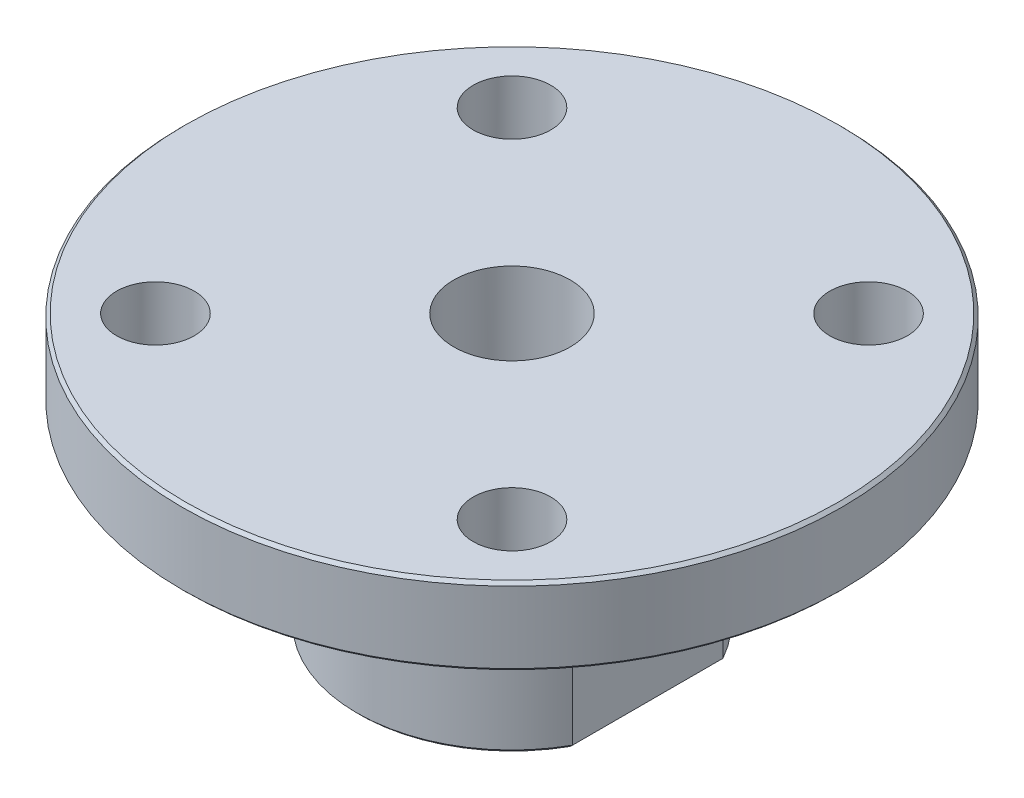
ISO-10303-21;
HEADER;
FILE_DESCRIPTION(('STEP AP214'),'2;1');
FILE_NAME('part.step','',(''),(''),'','','');
FILE_SCHEMA(('AUTOMOTIVE_DESIGN { 1 0 10303 214 1 1 1 1 }'));
ENDSEC;
DATA;
#1=APPLICATION_CONTEXT('core data for automotive mechanical design processes');
#2=APPLICATION_PROTOCOL_DEFINITION('international standard','automotive_design',2000,#1);
#3=PRODUCT_CONTEXT('',#1,'mechanical');
#4=PRODUCT('Part','Part','',(#3));
#5=PRODUCT_RELATED_PRODUCT_CATEGORY('part','',(#4));
#6=PRODUCT_DEFINITION_FORMATION('','',#4);
#7=PRODUCT_DEFINITION_CONTEXT('part definition',#1,'design');
#8=PRODUCT_DEFINITION('design','',#6,#7);
#9=PRODUCT_DEFINITION_SHAPE('','',#8);
#10=(LENGTH_UNIT() NAMED_UNIT(*) SI_UNIT(.MILLI.,.METRE.));
#11=(NAMED_UNIT(*) PLANE_ANGLE_UNIT() SI_UNIT($,.RADIAN.));
#12=(NAMED_UNIT(*) SI_UNIT($,.STERADIAN.) SOLID_ANGLE_UNIT());
#13=UNCERTAINTY_MEASURE_WITH_UNIT(LENGTH_MEASURE(1.E-05),#10,'distance_accuracy_value','');
#14=(GEOMETRIC_REPRESENTATION_CONTEXT(3) GLOBAL_UNCERTAINTY_ASSIGNED_CONTEXT((#13)) GLOBAL_UNIT_ASSIGNED_CONTEXT((#10,
#11,#12)) REPRESENTATION_CONTEXT('',''));
#15=CARTESIAN_POINT('',(0.,0.,0.));
#16=DIRECTION('',(0.,0.,1.));
#17=DIRECTION('',(1.,0.,0.));
#18=AXIS2_PLACEMENT_3D('',#15,#16,#17);
#19=CARTESIAN_POINT('',(0.00837207683599874,1.54621795524648,-2.2765147307595E-07));
#20=DIRECTION('',(0.,-1.,0.));
#21=DIRECTION('',(0.,0.,-1.));
#22=AXIS2_PLACEMENT_3D('',#19,#20,#21);
#23=CYLINDRICAL_SURFACE('',#22,5.08);
#24=DIRECTION('',(0.,-1.,0.));
#25=VECTOR('',#24,1.);
#26=CARTESIAN_POINT('',(4.453372076836,12.9762179552465,-2.45934465249318));
#27=LINE('',#26,#25);
#28=CARTESIAN_POINT('',(4.453372076836,7.89621795524648,-2.45934465249318));
#29=VERTEX_POINT('',#28);
#30=CARTESIAN_POINT('',(4.453372076836,1.64781795524648,-2.45934465249318));
#31=VERTEX_POINT('',#30);
#32=EDGE_CURVE('E101',#29,#31,#27,.T.);
#33=ORIENTED_EDGE('',*,*,#32,.T.);
#34=CARTESIAN_POINT('',(0.00837207683599874,1.64781795524647,-2.2765147307595E-07));
#35=DIRECTION('',(0.,-1.,0.));
#36=DIRECTION('',(0.,0.,-1.));
#37=AXIS2_PLACEMENT_3D('',#34,#35,#36);
#38=CIRCLE('',#37,5.08);
#39=CARTESIAN_POINT('',(-4.436627923164,1.64781795524648,-2.45934465249318));
#40=VERTEX_POINT('',#39);
#41=EDGE_CURVE('E54',#31,#40,#38,.F.);
#42=ORIENTED_EDGE('',*,*,#41,.T.);
#43=DIRECTION('',(0.,-1.,0.));
#44=VECTOR('',#43,1.);
#45=CARTESIAN_POINT('',(-4.436627923164,12.9762179552465,-2.45934465249318));
#46=LINE('',#45,#44);
#47=CARTESIAN_POINT('',(-4.436627923164,7.89621795524648,-2.45934465249318));
#48=VERTEX_POINT('',#47);
#49=EDGE_CURVE('E121',#48,#40,#46,.T.);
#50=ORIENTED_EDGE('',*,*,#49,.F.);
#51=CARTESIAN_POINT('',(0.00837207683599874,7.89621795524648,-2.2765147307595E-07));
#52=DIRECTION('',(0.,-1.,0.));
#53=DIRECTION('',(0.,0.,-1.));
#54=AXIS2_PLACEMENT_3D('',#51,#52,#53);
#55=CIRCLE('',#54,5.08);
#56=EDGE_CURVE('E118',#48,#29,#55,.T.);
#57=ORIENTED_EDGE('',*,*,#56,.T.);
#58=EDGE_LOOP('',(#33,#42,#50,#57));
#59=FACE_BOUND('',#58,.T.);
#60=ADVANCED_FACE('F32',(#59),#23,.T.);
#61=CARTESIAN_POINT('',(5.088372076836,1.54621795524648,-2.2765147307595E-07));
#62=DIRECTION('',(0.,-1.,0.));
#63=DIRECTION('',(0.,0.,-1.));
#64=AXIS2_PLACEMENT_3D('',#61,#62,#63);
#65=PLANE('',#64);
#66=CARTESIAN_POINT('',(0.00837207683599874,1.54621795524648,-2.2765147307595E-07));
#67=DIRECTION('',(0.,-1.,0.));
#68=DIRECTION('',(0.,0.,-1.));
#69=AXIS2_PLACEMENT_3D('',#66,#67,#68);
#70=CIRCLE('',#69,4.9784);
#71=CARTESIAN_POINT('',(-4.335027923164,1.54621795524648,-2.43297022335631));
#72=VERTEX_POINT('',#71);
#73=CARTESIAN_POINT('',(4.351772076836,1.54621795524648,-2.43297022335631));
#74=VERTEX_POINT('',#73);
#75=EDGE_CURVE('E152',#72,#74,#70,.T.);
#76=ORIENTED_EDGE('',*,*,#75,.T.);
#77=DIRECTION('',(0.,0.,1.));
#78=VECTOR('',#77,1.);
#79=CARTESIAN_POINT('',(4.351772076836,1.54621795524648,2.45934419719024));
#80=LINE('',#79,#78);
#81=CARTESIAN_POINT('',(4.351772076836,1.54621795524648,2.43296976805337));
#82=VERTEX_POINT('',#81);
#83=EDGE_CURVE('E158',#74,#82,#80,.T.);
#84=ORIENTED_EDGE('',*,*,#83,.T.);
#85=CARTESIAN_POINT('',(0.00837207683599874,1.54621795524648,-2.2765147307595E-07));
#86=DIRECTION('',(0.,-1.,0.));
#87=DIRECTION('',(0.,0.,-1.));
#88=AXIS2_PLACEMENT_3D('',#85,#86,#87);
#89=CIRCLE('',#88,4.9784);
#90=CARTESIAN_POINT('',(-4.335027923164,1.54621795524648,2.43296976805337));
#91=VERTEX_POINT('',#90);
#92=EDGE_CURVE('E156',#82,#91,#89,.T.);
#93=ORIENTED_EDGE('',*,*,#92,.T.);
#94=DIRECTION('',(0.,0.,-1.));
#95=VECTOR('',#94,1.);
#96=CARTESIAN_POINT('',(-4.335027923164,1.54621795524648,-2.45934465249318));
#97=LINE('',#96,#95);
#98=EDGE_CURVE('E154',#91,#72,#97,.T.);
#99=ORIENTED_EDGE('',*,*,#98,.T.);
#100=EDGE_LOOP('',(#76,#84,#93,#99));
#101=FACE_BOUND('',#100,.T.);
#102=CARTESIAN_POINT('',(0.00837207683599874,1.54621795524648,-2.2765147307595E-07));
#103=DIRECTION('',(0.,-1.,0.));
#104=DIRECTION('',(0.,0.,-1.));
#105=AXIS2_PLACEMENT_3D('',#102,#103,#104);
#106=CIRCLE('',#105,1.905);
#107=CARTESIAN_POINT('',(0.00837207683599874,1.54621795524648,-1.90500022765147));
#108=VERTEX_POINT('',#107);
#109=EDGE_CURVE('E128',#108,#108,#106,.T.);
#110=ORIENTED_EDGE('',*,*,#109,.F.);
#111=EDGE_LOOP('',(#110));
#112=FACE_BOUND('',#111,.T.);
#113=ADVANCED_FACE('F219',(#101,#112),#65,.T.);
#114=CARTESIAN_POINT('',(0.00837207683599874,1.54621795524648,-2.2765147307595E-07));
#115=DIRECTION('',(0.,-1.,0.));
#116=DIRECTION('',(0.,0.,-1.));
#117=AXIS2_PLACEMENT_3D('',#114,#115,#116);
#118=CYLINDRICAL_SURFACE('',#117,1.905);
#119=CARTESIAN_POINT('',(-1.41153108887637,5.35621795524648,-1.27000022765147));
#120=CARTESIAN_POINT('',(-1.41153715765289,5.41821193264805,-1.26999676053707));
#121=CARTESIAN_POINT('',(-1.41566667431526,5.48022758385157,-1.26542183004974));
#122=CARTESIAN_POINT('',(-1.43137594854927,5.60203909914475,-1.24751023146906));
#123=CARTESIAN_POINT('',(-1.44296906932471,5.66183077780775,-1.2341578468844));
#124=CARTESIAN_POINT('',(-1.47153724315637,5.77705496083881,-1.19974294929809));
#125=CARTESIAN_POINT('',(-1.48845984055972,5.83252364267489,-1.17875528704173));
#126=CARTESIAN_POINT('',(-1.52568692439359,5.93906275878661,-1.12988118095044));
#127=CARTESIAN_POINT('',(-1.54599211287258,5.99013227668154,-1.10199330440871));
#128=CARTESIAN_POINT('',(-1.59148548628237,6.09513372888321,-1.03506553120046));
#129=CARTESIAN_POINT('',(-1.61694176733781,6.1482738499969,-0.994965442769973));
#130=CARTESIAN_POINT('',(-1.66767757657033,6.24775967538165,-0.906902273004791));
#131=CARTESIAN_POINT('',(-1.6929569074562,6.29409868149964,-0.858931537325932));
#132=CARTESIAN_POINT('',(-1.7447919207898,6.38532667857284,-0.74812986229025));
#133=CARTESIAN_POINT('',(-1.77100451329196,6.42903935022403,-0.684153316834424));
#134=CARTESIAN_POINT('',(-1.81762429962955,6.50470568588267,-0.547669289926241));
#135=CARTESIAN_POINT('',(-1.83803797323108,6.53667248665628,-0.475171459375756));
#136=CARTESIAN_POINT('',(-1.86868733556501,6.58402626989256,-0.332263389311276));
#137=CARTESIAN_POINT('',(-1.87980788832476,6.60087087900116,-0.262531278141673));
#138=CARTESIAN_POINT('',(-1.8941498068472,6.62252510594159,-0.120456837594936));
#139=CARTESIAN_POINT('',(-1.89738112055498,6.62734988035464,-0.048117912267972));
#140=CARTESIAN_POINT('',(-1.89570947010475,6.62483844952883,0.0851831492460559));
#141=CARTESIAN_POINT('',(-1.89196870534331,6.61923990766015,0.146202577484084));
#142=CARTESIAN_POINT('',(-1.87889988388063,6.59949013763357,0.266216304475621));
#143=CARTESIAN_POINT('',(-1.8695714197022,6.58533828573373,0.325210455206101));
#144=CARTESIAN_POINT('',(-1.84615870548273,6.54925869540192,0.439469262769719));
#145=CARTESIAN_POINT('',(-1.83209336835401,6.5273618631454,0.494747718490712));
#146=CARTESIAN_POINT('',(-1.80024193658843,6.47664139197144,0.600842583013535));
#147=CARTESIAN_POINT('',(-1.78245516284578,6.44781648864302,0.651658175004097));
#148=CARTESIAN_POINT('',(-1.74180259432596,6.37985145695945,0.754560297745311));
#149=CARTESIAN_POINT('',(-1.71857651899336,6.33985357791746,0.805936362781671));
#150=CARTESIAN_POINT('',(-1.67057174476544,6.25290229377647,0.901692199962761));
#151=CARTESIAN_POINT('',(-1.64579068554072,6.20593815957851,0.946060958197078));
#152=CARTESIAN_POINT('',(-1.59278070855937,6.09792131676104,1.03360346666968));
#153=CARTESIAN_POINT('',(-1.56461385522074,6.03581331962779,1.07552208870088));
#154=CARTESIAN_POINT('',(-1.51229805194143,5.90389920734132,1.14830122825233));
#155=CARTESIAN_POINT('',(-1.48814240241046,5.83410625879363,1.1791802858071));
#156=CARTESIAN_POINT('',(-1.45379714961281,5.70882135083008,1.22131257335392));
#157=CARTESIAN_POINT('',(-1.44158923823239,5.65492616526042,1.23565129994541));
#158=CARTESIAN_POINT('',(-1.42297532582784,5.54478787921274,1.25716995028156));
#159=CARTESIAN_POINT('',(-1.41655926673121,5.48854902715167,1.26436228657225));
#160=CARTESIAN_POINT('',(-1.41051991003456,5.37498665885633,1.27113896329409));
#161=CARTESIAN_POINT('',(-1.41092616321887,5.31765949888694,1.27069020628141));
#162=CARTESIAN_POINT('',(-1.41853566350407,5.20401872068429,1.26213612104673));
#163=CARTESIAN_POINT('',(-1.4257444202238,5.14770596173554,1.25402458642978));
#164=CARTESIAN_POINT('',(-1.44532058030363,5.04037567510495,1.2312635733888));
#165=CARTESIAN_POINT('',(-1.45741866109298,4.98923386003938,1.2169529806231));
#166=CARTESIAN_POINT('',(-1.48533815981659,4.890047795345,1.18251608668034));
#167=CARTESIAN_POINT('',(-1.50116082785043,4.84200459262942,1.16238783237804));
#168=CARTESIAN_POINT('',(-1.53856084416034,4.74013968284825,1.11228702329823));
#169=CARTESIAN_POINT('',(-1.56065629092804,4.68708238009517,1.08115095551559));
#170=CARTESIAN_POINT('',(-1.60619489286125,4.58633328576696,1.01188961755843));
#171=CARTESIAN_POINT('',(-1.62963966477824,4.53864814216811,0.973755837861939));
#172=CARTESIAN_POINT('',(-1.6812084802623,4.43930186453922,0.88186654875959));
#173=CARTESIAN_POINT('',(-1.70923594418009,4.38904764659141,0.826518226697012));
#174=CARTESIAN_POINT('',(-1.7618528679222,4.29842436159676,0.706817947665731));
#175=CARTESIAN_POINT('',(-1.78644535709245,4.25804656050265,0.642474025537757));
#176=CARTESIAN_POINT('',(-1.82544963803967,4.19550670103042,0.519104318857109));
#177=CARTESIAN_POINT('',(-1.84090958216557,4.17133557492594,0.461430374050467));
#178=CARTESIAN_POINT('',(-1.86664771812304,4.13155238685391,0.342110517527426));
#179=CARTESIAN_POINT('',(-1.87693028585205,4.11593309593077,0.280468009899079));
#180=CARTESIAN_POINT('',(-1.89141053473294,4.09403038320863,0.154539336460978));
#181=CARTESIAN_POINT('',(-1.89558113110274,4.08778851375967,0.0902426937954062));
#182=CARTESIAN_POINT('',(-1.89732528669874,4.08517156959668,-0.0386434997301749));
#183=CARTESIAN_POINT('',(-1.89489945912609,4.08879557775432,-0.103233022806896));
#184=CARTESIAN_POINT('',(-1.88411560361995,4.10505173076445,-0.225906260806836));
#185=CARTESIAN_POINT('',(-1.87620173344657,4.11700973063372,-0.284121543501264));
#186=CARTESIAN_POINT('',(-1.85558219757804,4.1485990912351,-0.397521926254604));
#187=CARTESIAN_POINT('',(-1.84287578750811,4.16823164399199,-0.452706554067647));
#188=CARTESIAN_POINT('',(-1.81275563400133,4.21571903284784,-0.562068760997777));
#189=CARTESIAN_POINT('',(-1.79511205397325,4.24398390050586,-0.616003306793642));
#190=CARTESIAN_POINT('',(-1.75677176545925,4.30729361458398,-0.718536168455294));
#191=CARTESIAN_POINT('',(-1.73607323186142,4.342342517896,-0.767131263903235));
#192=CARTESIAN_POINT('',(-1.6895730380137,4.42443730823004,-0.865692058630375));
#193=CARTESIAN_POINT('',(-1.6634807762853,4.47250307527949,-0.914671242642152));
#194=CARTESIAN_POINT('',(-1.61121674423824,4.57587505412809,-1.00431636913961));
#195=CARTESIAN_POINT('',(-1.58504492917448,4.63118663215613,-1.04497609250838));
#196=CARTESIAN_POINT('',(-1.53711767946239,4.74399387537609,-1.11450938749338));
#197=CARTESIAN_POINT('',(-1.51517762397509,4.80100050456495,-1.14404573544876));
#198=CARTESIAN_POINT('',(-1.47592455826699,4.92015358035714,-1.1945355725122));
#199=CARTESIAN_POINT('',(-1.45860258188919,4.98228975584895,-1.21550573593794));
#200=CARTESIAN_POINT('',(-1.43429110291658,5.09635783769607,-1.24419549434174));
#201=CARTESIAN_POINT('',(-1.42586238901846,5.14749868560832,-1.2538218778216));
#202=CARTESIAN_POINT('',(-1.41448207018566,5.25116126956686,-1.26672309310165));
#203=CARTESIAN_POINT('',(-1.41152594595737,5.30368182985195,-1.27000316582007));
#204=CARTESIAN_POINT('',(-1.41153108887637,5.35621795524648,-1.27000022765147));
#205=B_SPLINE_CURVE_WITH_KNOTS('',3,(#119,#120,#121,#122,#123,#124,#125,#126,#127,#128,#129,
#130,#131,#132,#133,#134,#135,#136,#137,#138,#139,#140,#141,#142,#143,#144,#145,#146,#147,#148,
#149,#150,#151,#152,#153,#154,#155,#156,#157,#158,#159,#160,#161,#162,#163,#164,#165,#166,#167,
#168,#169,#170,#171,#172,#173,#174,#175,#176,#177,#178,#179,#180,#181,#182,#183,#184,#185,#186,
#187,#188,#189,#190,#191,#192,#193,#194,#195,#196,#197,#198,#199,#200,#201,#202,#203,#204),
.UNSPECIFIED.,.T.,.F.,(4,2,2,2,2,2,2,2,2,2,2,2,2,2,2,2,2,2,2,2,2,2,2,2,2,2,2,2,2,2,2,2,2,2,2,2,
2,2,2,2,2,2,4),(0.,0.185741901008567,0.371817291834648,0.556115633522332,0.740452273642586,
0.953482199385849,1.16672054207035,1.41076064688994,1.65452697661748,1.87094801110373,
2.08709600797069,2.27037604696896,2.45366945310179,2.63623953302976,2.81884295833405,
3.02544178976113,3.23236218395865,3.47140976725639,3.71005398287407,3.88065067404841,
4.05095053559534,4.22198823900153,4.39316459167329,4.55597546833904,4.71884106804548,
4.91426011082439,5.10991838567911,5.34831724669764,5.58650451512541,5.77894818687381,
5.97122893183132,6.16435920582967,6.35747152712255,6.5365425672753,6.71564143210904,
6.90510342994999,7.09467907915193,7.3140710098962,7.53362635014766,7.7364216987987,
7.93882039771211,8.09635551352155,8.25376047786503),.UNSPECIFIED.);
#206=CARTESIAN_POINT('',(-1.41153108887637,5.35621795524648,-1.27000022765147));
#207=VERTEX_POINT('',#206);
#208=EDGE_CURVE('E113',#207,#207,#205,.T.);
#209=ORIENTED_EDGE('',*,*,#208,.F.);
#210=EDGE_LOOP('',(#209));
#211=FACE_BOUND('',#210,.T.);
#212=ORIENTED_EDGE('',*,*,#109,.T.);
#213=EDGE_LOOP('',(#212));
#214=FACE_BOUND('',#213,.T.);
#215=CARTESIAN_POINT('',(0.00837207683599874,10.4362179552465,-2.2765147307595E-07));
#216=DIRECTION('',(0.,-1.,0.));
#217=DIRECTION('',(0.,0.,-1.));
#218=AXIS2_PLACEMENT_3D('',#215,#216,#217);
#219=CIRCLE('',#218,1.905);
#220=CARTESIAN_POINT('',(0.00837207683599874,10.4362179552465,-1.90500022765147));
#221=VERTEX_POINT('',#220);
#222=EDGE_CURVE('E120',#221,#221,#219,.T.);
#223=ORIENTED_EDGE('',*,*,#222,.F.);
#224=EDGE_LOOP('',(#223));
#225=FACE_BOUND('',#224,.T.);
#226=ADVANCED_FACE('F238',(#211,#214,#225),#118,.F.);
#227=CARTESIAN_POINT('',(10.803372076836,10.4362179552465,-2.2765147307595E-07));
#228=DIRECTION('',(0.,1.,0.));
#229=DIRECTION('',(0.,0.,1.));
#230=AXIS2_PLACEMENT_3D('',#227,#228,#229);
#231=PLANE('',#230);
#232=CARTESIAN_POINT('',(0.00837207683599874,10.4362179552465,-2.2765147307595E-07));
#233=DIRECTION('',(0.,1.,0.));
#234=DIRECTION('',(0.,0.,1.));
#235=AXIS2_PLACEMENT_3D('',#232,#233,#234);
#236=CIRCLE('',#235,10.6934);
#237=CARTESIAN_POINT('',(0.00837207683599874,10.4362179552465,10.6933997723485));
#238=VERTEX_POINT('',#237);
#239=EDGE_CURVE('E11',#238,#238,#236,.T.);
#240=ORIENTED_EDGE('',*,*,#239,.T.);
#241=EDGE_LOOP('',(#240));
#242=FACE_BOUND('',#241,.T.);
#243=CARTESIAN_POINT('',(-5.82879440185877,10.4362179552465,5.83716625104349));
#244=DIRECTION('',(0.,1.,0.));
#245=DIRECTION('',(0.,0.,1.));
#246=AXIS2_PLACEMENT_3D('',#243,#244,#245);
#247=CIRCLE('',#246,1.27);
#248=CARTESIAN_POINT('',(-5.82879440185877,10.4362179552465,7.10716625104349));
#249=VERTEX_POINT('',#248);
#250=EDGE_CURVE('E150',#249,#249,#247,.T.);
#251=ORIENTED_EDGE('',*,*,#250,.F.);
#252=EDGE_LOOP('',(#251));
#253=FACE_BOUND('',#252,.T.);
#254=CARTESIAN_POINT('',(5.84553855553113,10.4362179552465,5.8371662510433));
#255=DIRECTION('',(0.,1.,0.));
#256=DIRECTION('',(0.,0.,1.));
#257=AXIS2_PLACEMENT_3D('',#254,#255,#256);
#258=CIRCLE('',#257,1.27);
#259=CARTESIAN_POINT('',(5.84553855553113,10.4362179552465,7.1071662510433));
#260=VERTEX_POINT('',#259);
#261=EDGE_CURVE('E146',#260,#260,#258,.T.);
#262=ORIENTED_EDGE('',*,*,#261,.F.);
#263=EDGE_LOOP('',(#262));
#264=FACE_BOUND('',#263,.T.);
#265=CARTESIAN_POINT('',(5.84553855553094,10.4362179552465,-5.8371667063466));
#266=DIRECTION('',(0.,1.,0.));
#267=DIRECTION('',(0.,0.,1.));
#268=AXIS2_PLACEMENT_3D('',#265,#266,#267);
#269=CIRCLE('',#268,1.27);
#270=CARTESIAN_POINT('',(5.84553855553094,10.4362179552465,-4.5671667063466));
#271=VERTEX_POINT('',#270);
#272=EDGE_CURVE('E142',#271,#271,#269,.T.);
#273=ORIENTED_EDGE('',*,*,#272,.F.);
#274=EDGE_LOOP('',(#273));
#275=FACE_BOUND('',#274,.T.);
#276=CARTESIAN_POINT('',(-5.82879440185896,10.4362179552465,-5.83716670634641));
#277=DIRECTION('',(0.,1.,0.));
#278=DIRECTION('',(0.,0.,1.));
#279=AXIS2_PLACEMENT_3D('',#276,#277,#278);
#280=CIRCLE('',#279,1.27);
#281=CARTESIAN_POINT('',(-5.82879440185896,10.4362179552465,-4.56716670634641));
#282=VERTEX_POINT('',#281);
#283=EDGE_CURVE('E138',#282,#282,#280,.T.);
#284=ORIENTED_EDGE('',*,*,#283,.F.);
#285=EDGE_LOOP('',(#284));
#286=FACE_BOUND('',#285,.T.);
#287=ORIENTED_EDGE('',*,*,#222,.T.);
#288=EDGE_LOOP('',(#287));
#289=FACE_BOUND('',#288,.T.);
#290=ADVANCED_FACE('F246',(#242,#253,#264,#275,#286,#289),#231,.T.);
#291=CARTESIAN_POINT('',(0.00837207683599874,1.54621795524648,-2.2765147307595E-07));
#292=DIRECTION('',(0.,-1.,0.));
#293=DIRECTION('',(0.,0.,-1.));
#294=AXIS2_PLACEMENT_3D('',#291,#292,#293);
#295=CYLINDRICAL_SURFACE('',#294,10.795);
#296=CARTESIAN_POINT('',(0.00837207683599874,7.99781795524647,-2.2765147307595E-07));
#297=DIRECTION('',(0.,-1.,0.));
#298=DIRECTION('',(0.,0.,-1.));
#299=AXIS2_PLACEMENT_3D('',#296,#297,#298);
#300=CIRCLE('',#299,10.795);
#301=CARTESIAN_POINT('',(0.00837207683599874,7.99781795524647,-10.7950002276515));
#302=VERTEX_POINT('',#301);
#303=EDGE_CURVE('E46',#302,#302,#300,.F.);
#304=ORIENTED_EDGE('',*,*,#303,.T.);
#305=EDGE_LOOP('',(#304));
#306=FACE_BOUND('',#305,.T.);
#307=CARTESIAN_POINT('',(0.00837207683599874,10.3346179552465,-2.2765147307595E-07));
#308=DIRECTION('',(0.,1.,0.));
#309=DIRECTION('',(0.,0.,1.));
#310=AXIS2_PLACEMENT_3D('',#307,#308,#309);
#311=CIRCLE('',#310,10.795);
#312=CARTESIAN_POINT('',(0.00837207683599874,10.3346179552465,10.7949997723485));
#313=VERTEX_POINT('',#312);
#314=EDGE_CURVE('E167',#313,#313,#311,.F.);
#315=ORIENTED_EDGE('',*,*,#314,.T.);
#316=EDGE_LOOP('',(#315));
#317=FACE_BOUND('',#316,.T.);
#318=ADVANCED_FACE('F242',(#306,#317),#295,.T.);
#319=CARTESIAN_POINT('',(5.088372076836,7.89621795524648,-2.2765147307595E-07));
#320=DIRECTION('',(0.,-1.,0.));
#321=DIRECTION('',(0.,0.,-1.));
#322=AXIS2_PLACEMENT_3D('',#319,#320,#321);
#323=PLANE('',#322);
#324=CARTESIAN_POINT('',(0.00837207683599874,7.89621795524648,-2.2765147307595E-07));
#325=DIRECTION('',(0.,-1.,0.));
#326=DIRECTION('',(0.,0.,-1.));
#327=AXIS2_PLACEMENT_3D('',#324,#325,#326);
#328=CIRCLE('',#327,10.6934);
#329=CARTESIAN_POINT('',(0.00837207683599874,7.89621795524648,-10.6934002276515));
#330=VERTEX_POINT('',#329);
#331=EDGE_CURVE('E164',#330,#330,#328,.T.);
#332=ORIENTED_EDGE('',*,*,#331,.T.);
#333=EDGE_LOOP('',(#332));
#334=FACE_BOUND('',#333,.T.);
#335=CARTESIAN_POINT('',(-5.82879440185877,7.89621795524648,5.83716625104349));
#336=DIRECTION('',(0.,-1.,0.));
#337=DIRECTION('',(0.,0.,-1.));
#338=AXIS2_PLACEMENT_3D('',#335,#336,#337);
#339=CIRCLE('',#338,1.27);
#340=CARTESIAN_POINT('',(-5.82879440185877,7.89621795524648,4.56716625104349));
#341=VERTEX_POINT('',#340);
#342=EDGE_CURVE('E147',#341,#341,#339,.T.);
#343=ORIENTED_EDGE('',*,*,#342,.F.);
#344=EDGE_LOOP('',(#343));
#345=FACE_BOUND('',#344,.T.);
#346=CARTESIAN_POINT('',(5.84553855553113,7.89621795524648,5.8371662510433));
#347=DIRECTION('',(0.,-1.,0.));
#348=DIRECTION('',(0.,0.,-1.));
#349=AXIS2_PLACEMENT_3D('',#346,#347,#348);
#350=CIRCLE('',#349,1.27);
#351=CARTESIAN_POINT('',(5.84553855553113,7.89621795524648,4.5671662510433));
#352=VERTEX_POINT('',#351);
#353=EDGE_CURVE('E143',#352,#352,#350,.T.);
#354=ORIENTED_EDGE('',*,*,#353,.F.);
#355=EDGE_LOOP('',(#354));
#356=FACE_BOUND('',#355,.T.);
#357=CARTESIAN_POINT('',(5.84553855553094,7.89621795524648,-5.8371667063466));
#358=DIRECTION('',(0.,-1.,0.));
#359=DIRECTION('',(0.,0.,-1.));
#360=AXIS2_PLACEMENT_3D('',#357,#358,#359);
#361=CIRCLE('',#360,1.27);
#362=CARTESIAN_POINT('',(5.84553855553094,7.89621795524648,-7.1071667063466));
#363=VERTEX_POINT('',#362);
#364=EDGE_CURVE('E139',#363,#363,#361,.T.);
#365=ORIENTED_EDGE('',*,*,#364,.F.);
#366=EDGE_LOOP('',(#365));
#367=FACE_BOUND('',#366,.T.);
#368=CARTESIAN_POINT('',(-5.82879440185896,7.89621795524648,-5.83716670634641));
#369=DIRECTION('',(0.,-1.,0.));
#370=DIRECTION('',(0.,0.,-1.));
#371=AXIS2_PLACEMENT_3D('',#368,#369,#370);
#372=CIRCLE('',#371,1.27);
#373=CARTESIAN_POINT('',(-5.82879440185896,7.89621795524648,-7.10716670634641));
#374=VERTEX_POINT('',#373);
#375=EDGE_CURVE('E135',#374,#374,#372,.T.);
#376=ORIENTED_EDGE('',*,*,#375,.F.);
#377=EDGE_LOOP('',(#376));
#378=FACE_BOUND('',#377,.T.);
#379=DIRECTION('',(0.,0.,1.));
#380=VECTOR('',#379,1.);
#381=CARTESIAN_POINT('',(4.453372076836,7.89621795524648,-2.45934465249318));
#382=LINE('',#381,#380);
#383=CARTESIAN_POINT('',(4.453372076836,7.89621795524648,2.45934419719024));
#384=VERTEX_POINT('',#383);
#385=EDGE_CURVE('E95',#29,#384,#382,.T.);
#386=ORIENTED_EDGE('',*,*,#385,.F.);
#387=ORIENTED_EDGE('',*,*,#56,.F.);
#388=DIRECTION('',(0.,0.,-1.));
#389=VECTOR('',#388,1.);
#390=CARTESIAN_POINT('',(-4.436627923164,7.89621795524648,-2.45934465249318));
#391=LINE('',#390,#389);
#392=CARTESIAN_POINT('',(-4.436627923164,7.89621795524648,2.45934419719024));
#393=VERTEX_POINT('',#392);
#394=EDGE_CURVE('E117',#393,#48,#391,.T.);
#395=ORIENTED_EDGE('',*,*,#394,.F.);
#396=EDGE_CURVE('E110',#384,#393,#55,.T.);
#397=ORIENTED_EDGE('',*,*,#396,.F.);
#398=EDGE_LOOP('',(#386,#387,#395,#397));
#399=FACE_BOUND('',#398,.T.);
#400=ADVANCED_FACE('F116',(#334,#345,#356,#367,#378,#399),#323,.T.);
#401=DIRECTION('',(0.,-1.,0.));
#402=VECTOR('',#401,1.);
#403=CARTESIAN_POINT('',(-4.436627923164,12.9762179552465,2.45934419719024));
#404=LINE('',#403,#402);
#405=CARTESIAN_POINT('',(-4.436627923164,1.64781795524648,2.45934419719024));
#406=VERTEX_POINT('',#405);
#407=EDGE_CURVE('E106',#393,#406,#404,.T.);
#408=ORIENTED_EDGE('',*,*,#407,.T.);
#409=CARTESIAN_POINT('',(0.00837207683599874,1.64781795524647,-2.2765147307595E-07));
#410=DIRECTION('',(0.,-1.,0.));
#411=DIRECTION('',(0.,0.,-1.));
#412=AXIS2_PLACEMENT_3D('',#409,#410,#411);
#413=CIRCLE('',#412,5.08);
#414=CARTESIAN_POINT('',(4.453372076836,1.64781795524648,2.45934419719024));
#415=VERTEX_POINT('',#414);
#416=EDGE_CURVE('E112',#406,#415,#413,.F.);
#417=ORIENTED_EDGE('',*,*,#416,.T.);
#418=DIRECTION('',(0.,-1.,0.));
#419=VECTOR('',#418,1.);
#420=CARTESIAN_POINT('',(4.453372076836,12.9762179552465,2.45934419719024));
#421=LINE('',#420,#419);
#422=EDGE_CURVE('E99',#384,#415,#421,.T.);
#423=ORIENTED_EDGE('',*,*,#422,.F.);
#424=ORIENTED_EDGE('',*,*,#396,.T.);
#425=EDGE_LOOP('',(#408,#417,#423,#424));
#426=FACE_BOUND('',#425,.T.);
#427=ADVANCED_FACE('F109',(#426),#23,.T.);
#428=CARTESIAN_POINT('',(-4.436627923164,12.9762179552465,-2.45934465249318));
#429=DIRECTION('',(1.,0.,0.));
#430=DIRECTION('',(0.,0.,-1.));
#431=AXIS2_PLACEMENT_3D('',#428,#429,#430);
#432=PLANE('',#431);
#433=CARTESIAN_POINT('',(-4.436627923164,5.35621795524648,-2.2765147307595E-07));
#434=DIRECTION('',(1.,0.,0.));
#435=DIRECTION('',(0.,0.,-1.));
#436=AXIS2_PLACEMENT_3D('',#433,#434,#435);
#437=CIRCLE('',#436,1.27);
#438=CARTESIAN_POINT('',(-4.436627923164,5.35621795524648,-1.27000022765147));
#439=VERTEX_POINT('',#438);
#440=EDGE_CURVE('E132',#439,#439,#437,.T.);
#441=ORIENTED_EDGE('',*,*,#440,.T.);
#442=EDGE_LOOP('',(#441));
#443=FACE_BOUND('',#442,.T.);
#444=ORIENTED_EDGE('',*,*,#49,.T.);
#445=DIRECTION('',(0.,0.,1.));
#446=VECTOR('',#445,1.);
#447=CARTESIAN_POINT('',(-4.436627923164,1.64781795524647,2.45934419719024));
#448=LINE('',#447,#446);
#449=EDGE_CURVE('E61',#40,#406,#448,.T.);
#450=ORIENTED_EDGE('',*,*,#449,.T.);
#451=ORIENTED_EDGE('',*,*,#407,.F.);
#452=ORIENTED_EDGE('',*,*,#394,.T.);
#453=EDGE_LOOP('',(#444,#450,#451,#452));
#454=FACE_BOUND('',#453,.T.);
#455=ADVANCED_FACE('F223',(#443,#454),#432,.F.);
#456=CARTESIAN_POINT('',(4.453372076836,12.9762179552465,-2.45934465249318));
#457=DIRECTION('',(-1.,0.,0.));
#458=DIRECTION('',(0.,0.,1.));
#459=AXIS2_PLACEMENT_3D('',#456,#457,#458);
#460=PLANE('',#459);
#461=ORIENTED_EDGE('',*,*,#422,.T.);
#462=DIRECTION('',(0.,0.,-1.));
#463=VECTOR('',#462,1.);
#464=CARTESIAN_POINT('',(4.453372076836,1.64781795524647,-2.45934465249318));
#465=LINE('',#464,#463);
#466=EDGE_CURVE('E131',#415,#31,#465,.T.);
#467=ORIENTED_EDGE('',*,*,#466,.T.);
#468=ORIENTED_EDGE('',*,*,#32,.F.);
#469=ORIENTED_EDGE('',*,*,#385,.T.);
#470=EDGE_LOOP('',(#461,#467,#468,#469));
#471=FACE_BOUND('',#470,.T.);
#472=ADVANCED_FACE('F97',(#471),#460,.F.);
#473=CARTESIAN_POINT('',(-10.786627923164,5.35621795524648,-2.2765147307595E-07));
#474=DIRECTION('',(1.,0.,0.));
#475=DIRECTION('',(0.,0.,-1.));
#476=AXIS2_PLACEMENT_3D('',#473,#474,#475);
#477=CYLINDRICAL_SURFACE('',#476,1.27);
#478=ORIENTED_EDGE('',*,*,#208,.T.);
#479=EDGE_LOOP('',(#478));
#480=FACE_BOUND('',#479,.T.);
#481=ORIENTED_EDGE('',*,*,#440,.F.);
#482=EDGE_LOOP('',(#481));
#483=FACE_BOUND('',#482,.T.);
#484=ADVANCED_FACE('F231',(#480,#483),#477,.F.);
#485=CARTESIAN_POINT('',(-5.82879440185896,1.54621795524648,-5.83716670634641));
#486=DIRECTION('',(0.,1.,0.));
#487=DIRECTION('',(0.,0.,1.));
#488=AXIS2_PLACEMENT_3D('',#485,#486,#487);
#489=CYLINDRICAL_SURFACE('',#488,1.27);
#490=ORIENTED_EDGE('',*,*,#375,.T.);
#491=EDGE_LOOP('',(#490));
#492=FACE_BOUND('',#491,.T.);
#493=ORIENTED_EDGE('',*,*,#283,.T.);
#494=EDGE_LOOP('',(#493));
#495=FACE_BOUND('',#494,.T.);
#496=ADVANCED_FACE('F263',(#492,#495),#489,.F.);
#497=CARTESIAN_POINT('',(5.84553855553094,1.54621795524648,-5.8371667063466));
#498=DIRECTION('',(0.,1.,0.));
#499=DIRECTION('',(0.,0.,1.));
#500=AXIS2_PLACEMENT_3D('',#497,#498,#499);
#501=CYLINDRICAL_SURFACE('',#500,1.27);
#502=ORIENTED_EDGE('',*,*,#364,.T.);
#503=EDGE_LOOP('',(#502));
#504=FACE_BOUND('',#503,.T.);
#505=ORIENTED_EDGE('',*,*,#272,.T.);
#506=EDGE_LOOP('',(#505));
#507=FACE_BOUND('',#506,.T.);
#508=ADVANCED_FACE('F267',(#504,#507),#501,.F.);
#509=CARTESIAN_POINT('',(5.84553855553113,1.54621795524648,5.8371662510433));
#510=DIRECTION('',(0.,1.,0.));
#511=DIRECTION('',(0.,0.,1.));
#512=AXIS2_PLACEMENT_3D('',#509,#510,#511);
#513=CYLINDRICAL_SURFACE('',#512,1.27);
#514=ORIENTED_EDGE('',*,*,#353,.T.);
#515=EDGE_LOOP('',(#514));
#516=FACE_BOUND('',#515,.T.);
#517=ORIENTED_EDGE('',*,*,#261,.T.);
#518=EDGE_LOOP('',(#517));
#519=FACE_BOUND('',#518,.T.);
#520=ADVANCED_FACE('F271',(#516,#519),#513,.F.);
#521=CARTESIAN_POINT('',(-5.82879440185877,1.54621795524648,5.83716625104349));
#522=DIRECTION('',(0.,1.,0.));
#523=DIRECTION('',(0.,0.,1.));
#524=AXIS2_PLACEMENT_3D('',#521,#522,#523);
#525=CYLINDRICAL_SURFACE('',#524,1.27);
#526=ORIENTED_EDGE('',*,*,#342,.T.);
#527=EDGE_LOOP('',(#526));
#528=FACE_BOUND('',#527,.T.);
#529=ORIENTED_EDGE('',*,*,#250,.T.);
#530=EDGE_LOOP('',(#529));
#531=FACE_BOUND('',#530,.T.);
#532=ADVANCED_FACE('F200',(#528,#531),#525,.F.);
#533=CARTESIAN_POINT('',(-4.436627923164,1.64781795524647,-2.45934465249318));
#534=DIRECTION('',(-0.707106781186541,-0.707106781186554,0.));
#535=DIRECTION('',(0.707106781186554,-0.707106781186541,0.));
#536=AXIS2_PLACEMENT_3D('',#533,#534,#535);
#537=PLANE('',#536);
#538=CARTESIAN_POINT('',(-4.335027923164,1.54621795524648,-2.43297022335631));
#539=CARTESIAN_POINT('',(-4.35195828098373,1.56314831306621,-2.4373888865006));
#540=CARTESIAN_POINT('',(-4.36889012657986,1.58008015866233,-2.44179608717254));
#541=CARTESIAN_POINT('',(-4.40275679324654,1.61394682532901,-2.45058756355139));
#542=CARTESIAN_POINT('',(-4.41969161431708,1.63088164639955,-2.4549718392584));
#543=CARTESIAN_POINT('',(-4.436627923164,1.64781795524647,-2.45934465249318));
#544=B_SPLINE_CURVE_WITH_KNOTS('',3,(#538,#539,#540,#541,#542,#543),.UNSPECIFIED.,.F.,.F.,(4,2,
4),(0.,0.073042343028577,0.14608468571908),.UNSPECIFIED.);
#545=EDGE_CURVE('E203',#72,#40,#544,.T.);
#546=ORIENTED_EDGE('',*,*,#545,.F.);
#547=ORIENTED_EDGE('',*,*,#98,.F.);
#548=CARTESIAN_POINT('',(-4.335027923164,1.54621795524648,2.43296976805337));
#549=CARTESIAN_POINT('',(-4.35195828098373,1.56314831306621,2.43738843119765));
#550=CARTESIAN_POINT('',(-4.36889012657986,1.58008015866233,2.44179563186959));
#551=CARTESIAN_POINT('',(-4.40275679324654,1.61394682532901,2.45058710824844));
#552=CARTESIAN_POINT('',(-4.41969161431708,1.63088164639955,2.45497138395546));
#553=CARTESIAN_POINT('',(-4.436627923164,1.64781795524647,2.45934419719024));
#554=B_SPLINE_CURVE_WITH_KNOTS('',3,(#548,#549,#550,#551,#552,#553),.UNSPECIFIED.,.F.,.F.,(4,2,
4),(0.,0.073042343028577,0.14608468571908),.UNSPECIFIED.);
#555=EDGE_CURVE('E36',#406,#91,#554,.F.);
#556=ORIENTED_EDGE('',*,*,#555,.F.);
#557=ORIENTED_EDGE('',*,*,#449,.F.);
#558=EDGE_LOOP('',(#546,#547,#556,#557));
#559=FACE_BOUND('',#558,.T.);
#560=ADVANCED_FACE('F195',(#559),#537,.T.);
#561=CARTESIAN_POINT('',(0.00837207683599874,1.54621795524648,-2.2765147307595E-07));
#562=DIRECTION('',(0.,1.,0.));
#563=DIRECTION('',(0.,0.,1.));
#564=AXIS2_PLACEMENT_3D('',#561,#562,#563);
#565=CONICAL_SURFACE('',#564,4.9784,0.785398163397455);
#566=ORIENTED_EDGE('',*,*,#555,.T.);
#567=ORIENTED_EDGE('',*,*,#92,.F.);
#568=CARTESIAN_POINT('',(4.351772076836,1.54621795524648,2.43296976805337));
#569=CARTESIAN_POINT('',(4.36870243465573,1.56314831306621,2.43738843119765));
#570=CARTESIAN_POINT('',(4.38563428025186,1.58008015866233,2.44179563186959));
#571=CARTESIAN_POINT('',(4.41950094691854,1.61394682532901,2.45058710824844));
#572=CARTESIAN_POINT('',(4.43643576798907,1.63088164639955,2.45497138395546));
#573=CARTESIAN_POINT('',(4.453372076836,1.64781795524647,2.45934419719024));
#574=B_SPLINE_CURVE_WITH_KNOTS('',3,(#568,#569,#570,#571,#572,#573),.UNSPECIFIED.,.F.,.F.,(4,2,
4),(0.,0.073042343028577,0.14608468571908),.UNSPECIFIED.);
#575=EDGE_CURVE('E179',#415,#82,#574,.F.);
#576=ORIENTED_EDGE('',*,*,#575,.F.);
#577=ORIENTED_EDGE('',*,*,#416,.F.);
#578=EDGE_LOOP('',(#566,#567,#576,#577));
#579=FACE_BOUND('',#578,.T.);
#580=ADVANCED_FACE('F191',(#579),#565,.T.);
#581=CARTESIAN_POINT('',(0.00837207683599874,1.54621795524648,-2.2765147307595E-07));
#582=DIRECTION('',(0.,1.,0.));
#583=DIRECTION('',(0.,0.,1.));
#584=AXIS2_PLACEMENT_3D('',#581,#582,#583);
#585=CONICAL_SURFACE('',#584,4.9784,0.785398163397455);
#586=ORIENTED_EDGE('',*,*,#545,.T.);
#587=ORIENTED_EDGE('',*,*,#41,.F.);
#588=CARTESIAN_POINT('',(4.453372076836,1.64781795524647,-2.45934465249318));
#589=CARTESIAN_POINT('',(4.43643576798907,1.63088164639955,-2.4549718392584));
#590=CARTESIAN_POINT('',(4.41950094691854,1.61394682532901,-2.45058756355139));
#591=CARTESIAN_POINT('',(4.38563428025186,1.58008015866233,-2.44179608717254));
#592=CARTESIAN_POINT('',(4.36870243465573,1.56314831306621,-2.43738888650059));
#593=CARTESIAN_POINT('',(4.351772076836,1.54621795524648,-2.43297022335631));
#594=B_SPLINE_CURVE_WITH_KNOTS('',3,(#588,#589,#590,#591,#592,#593),.UNSPECIFIED.,.F.,.F.,(4,2,
4),(0.,0.0730423426905031,0.14608468571908),.UNSPECIFIED.);
#595=EDGE_CURVE('E172',#74,#31,#594,.F.);
#596=ORIENTED_EDGE('',*,*,#595,.F.);
#597=ORIENTED_EDGE('',*,*,#75,.F.);
#598=EDGE_LOOP('',(#586,#587,#596,#597));
#599=FACE_BOUND('',#598,.T.);
#600=ADVANCED_FACE('F183',(#599),#585,.T.);
#601=CARTESIAN_POINT('',(4.453372076836,1.64781795524647,-2.45934465249318));
#602=DIRECTION('',(0.707106781186541,-0.707106781186554,0.));
#603=DIRECTION('',(0.707106781186554,0.707106781186541,0.));
#604=AXIS2_PLACEMENT_3D('',#601,#602,#603);
#605=PLANE('',#604);
#606=ORIENTED_EDGE('',*,*,#575,.T.);
#607=ORIENTED_EDGE('',*,*,#83,.F.);
#608=ORIENTED_EDGE('',*,*,#595,.T.);
#609=ORIENTED_EDGE('',*,*,#466,.F.);
#610=EDGE_LOOP('',(#606,#607,#608,#609));
#611=FACE_BOUND('',#610,.T.);
#612=ADVANCED_FACE('F186',(#611),#605,.T.);
#613=CARTESIAN_POINT('',(0.00837207683599874,7.89621795524648,-2.2765147307595E-07));
#614=DIRECTION('',(0.,1.,0.));
#615=DIRECTION('',(0.,0.,1.));
#616=AXIS2_PLACEMENT_3D('',#613,#614,#615);
#617=CONICAL_SURFACE('',#616,10.6934,0.785398163397482);
#618=ORIENTED_EDGE('',*,*,#303,.F.);
#619=EDGE_LOOP('',(#618));
#620=FACE_BOUND('',#619,.T.);
#621=ORIENTED_EDGE('',*,*,#331,.F.);
#622=EDGE_LOOP('',(#621));
#623=FACE_BOUND('',#622,.T.);
#624=ADVANCED_FACE('F189',(#620,#623),#617,.T.);
#625=CARTESIAN_POINT('',(0.00837207683599874,10.3346179552465,-2.2765147307595E-07));
#626=DIRECTION('',(0.,-1.,0.));
#627=DIRECTION('',(0.,0.,-1.));
#628=AXIS2_PLACEMENT_3D('',#625,#626,#627);
#629=CONICAL_SURFACE('',#628,10.795,0.785398163397448);
#630=ORIENTED_EDGE('',*,*,#239,.F.);
#631=EDGE_LOOP('',(#630));
#632=FACE_BOUND('',#631,.T.);
#633=ORIENTED_EDGE('',*,*,#314,.F.);
#634=EDGE_LOOP('',(#633));
#635=FACE_BOUND('',#634,.T.);
#636=ADVANCED_FACE('F34',(#632,#635),#629,.T.);
#637=CLOSED_SHELL('',(#60,#113,#226,#290,#318,#400,#427,#455,#472,#484,#496,#508,#520,#532,#560,
#580,#600,#612,#624,#636));
#638=MANIFOLD_SOLID_BREP('B2',#637);
#639=ADVANCED_BREP_SHAPE_REPRESENTATION('',(#18,#638),#14);
#640=SHAPE_DEFINITION_REPRESENTATION(#9,#639);
ENDSEC;
END-ISO-10303-21;
